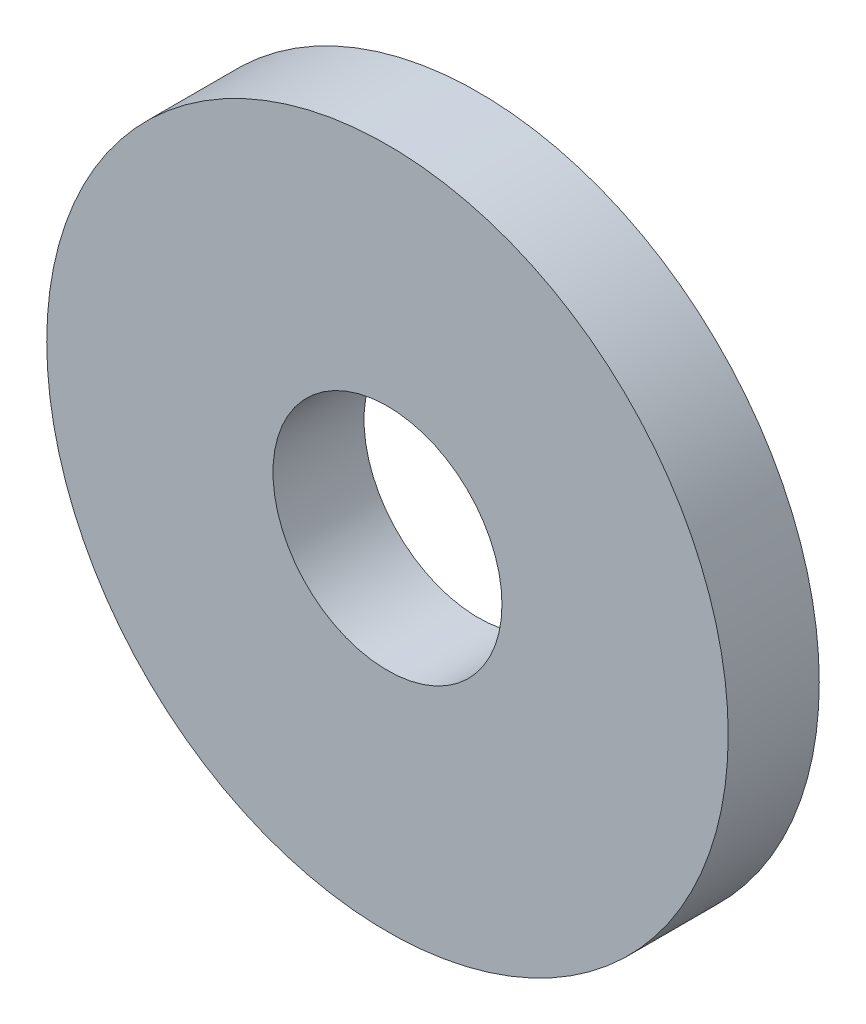
ISO-10303-21;
HEADER;
FILE_DESCRIPTION(('STEP AP214'),'2;1');
FILE_NAME('part.step','',(''),(''),'','','');
FILE_SCHEMA(('AUTOMOTIVE_DESIGN { 1 0 10303 214 1 1 1 1 }'));
ENDSEC;
DATA;
#1=APPLICATION_CONTEXT('core data for automotive mechanical design processes');
#2=APPLICATION_PROTOCOL_DEFINITION('international standard','automotive_design',2000,#1);
#3=PRODUCT_CONTEXT('',#1,'mechanical');
#4=PRODUCT('Part','Part','',(#3));
#5=PRODUCT_RELATED_PRODUCT_CATEGORY('part','',(#4));
#6=PRODUCT_DEFINITION_FORMATION('','',#4);
#7=PRODUCT_DEFINITION_CONTEXT('part definition',#1,'design');
#8=PRODUCT_DEFINITION('design','',#6,#7);
#9=PRODUCT_DEFINITION_SHAPE('','',#8);
#10=(LENGTH_UNIT() NAMED_UNIT(*) SI_UNIT(.MILLI.,.METRE.));
#11=(NAMED_UNIT(*) PLANE_ANGLE_UNIT() SI_UNIT($,.RADIAN.));
#12=(NAMED_UNIT(*) SI_UNIT($,.STERADIAN.) SOLID_ANGLE_UNIT());
#13=UNCERTAINTY_MEASURE_WITH_UNIT(LENGTH_MEASURE(1.E-05),#10,'distance_accuracy_value','');
#14=(GEOMETRIC_REPRESENTATION_CONTEXT(3) GLOBAL_UNCERTAINTY_ASSIGNED_CONTEXT((#13)) GLOBAL_UNIT_ASSIGNED_CONTEXT((#10,
#11,#12)) REPRESENTATION_CONTEXT('',''));
#15=CARTESIAN_POINT('',(0.,0.,0.));
#16=DIRECTION('',(0.,0.,1.));
#17=DIRECTION('',(1.,0.,0.));
#18=AXIS2_PLACEMENT_3D('',#15,#16,#17);
#19=CARTESIAN_POINT('',(0.,0.,4.));
#20=DIRECTION('',(0.,0.,1.));
#21=DIRECTION('',(1.,0.,0.));
#22=AXIS2_PLACEMENT_3D('',#19,#20,#21);
#23=PLANE('',#22);
#24=CARTESIAN_POINT('',(0.,0.,4.));
#25=DIRECTION('',(0.,0.,1.));
#26=DIRECTION('',(1.,0.,0.));
#27=AXIS2_PLACEMENT_3D('',#24,#25,#26);
#28=CIRCLE('',#27,14.97);
#29=CARTESIAN_POINT('',(14.97,0.,4.));
#30=VERTEX_POINT('',#29);
#31=EDGE_CURVE('E10',#30,#30,#28,.T.);
#32=ORIENTED_EDGE('',*,*,#31,.T.);
#33=EDGE_LOOP('',(#32));
#34=FACE_BOUND('',#33,.T.);
#35=CARTESIAN_POINT('',(0.,0.,4.));
#36=DIRECTION('',(0.,0.,1.));
#37=DIRECTION('',(1.,0.,0.));
#38=AXIS2_PLACEMENT_3D('',#35,#36,#37);
#39=CIRCLE('',#38,5.03);
#40=CARTESIAN_POINT('',(5.03,0.,4.));
#41=VERTEX_POINT('',#40);
#42=EDGE_CURVE('E50',#41,#41,#39,.T.);
#43=ORIENTED_EDGE('',*,*,#42,.F.);
#44=EDGE_LOOP('',(#43));
#45=FACE_BOUND('',#44,.T.);
#46=ADVANCED_FACE('F37',(#34,#45),#23,.T.);
#47=CARTESIAN_POINT('',(0.,0.,0.));
#48=DIRECTION('',(0.,0.,1.));
#49=DIRECTION('',(1.,0.,0.));
#50=AXIS2_PLACEMENT_3D('',#47,#48,#49);
#51=PLANE('',#50);
#52=CARTESIAN_POINT('',(0.,0.,0.));
#53=DIRECTION('',(0.,0.,1.));
#54=DIRECTION('',(1.,0.,0.));
#55=AXIS2_PLACEMENT_3D('',#52,#53,#54);
#56=CIRCLE('',#55,14.97);
#57=CARTESIAN_POINT('',(14.97,0.,0.));
#58=VERTEX_POINT('',#57);
#59=EDGE_CURVE('E41',#58,#58,#56,.T.);
#60=ORIENTED_EDGE('',*,*,#59,.F.);
#61=EDGE_LOOP('',(#60));
#62=FACE_BOUND('',#61,.T.);
#63=CARTESIAN_POINT('',(0.,0.,0.));
#64=DIRECTION('',(0.,0.,1.));
#65=DIRECTION('',(1.,0.,0.));
#66=AXIS2_PLACEMENT_3D('',#63,#64,#65);
#67=CIRCLE('',#66,5.03);
#68=CARTESIAN_POINT('',(5.03,0.,0.));
#69=VERTEX_POINT('',#68);
#70=EDGE_CURVE('E52',#69,#69,#67,.T.);
#71=ORIENTED_EDGE('',*,*,#70,.T.);
#72=EDGE_LOOP('',(#71));
#73=FACE_BOUND('',#72,.T.);
#74=ADVANCED_FACE('F64',(#62,#73),#51,.F.);
#75=CARTESIAN_POINT('',(0.,0.,4.));
#76=DIRECTION('',(0.,0.,-1.));
#77=DIRECTION('',(-1.,0.,0.));
#78=AXIS2_PLACEMENT_3D('',#75,#76,#77);
#79=CYLINDRICAL_SURFACE('',#78,14.97);
#80=ORIENTED_EDGE('',*,*,#31,.F.);
#81=EDGE_LOOP('',(#80));
#82=FACE_BOUND('',#81,.T.);
#83=ORIENTED_EDGE('',*,*,#59,.T.);
#84=EDGE_LOOP('',(#83));
#85=FACE_BOUND('',#84,.T.);
#86=ADVANCED_FACE('F39',(#82,#85),#79,.T.);
#87=CARTESIAN_POINT('',(0.,0.,4.));
#88=DIRECTION('',(0.,0.,-1.));
#89=DIRECTION('',(-1.,0.,0.));
#90=AXIS2_PLACEMENT_3D('',#87,#88,#89);
#91=CYLINDRICAL_SURFACE('',#90,5.03);
#92=ORIENTED_EDGE('',*,*,#42,.T.);
#93=EDGE_LOOP('',(#92));
#94=FACE_BOUND('',#93,.T.);
#95=ORIENTED_EDGE('',*,*,#70,.F.);
#96=EDGE_LOOP('',(#95));
#97=FACE_BOUND('',#96,.T.);
#98=ADVANCED_FACE('F60',(#94,#97),#91,.F.);
#99=CLOSED_SHELL('',(#46,#74,#86,#98));
#100=MANIFOLD_SOLID_BREP('B2',#99);
#101=ADVANCED_BREP_SHAPE_REPRESENTATION('',(#18,#100),#14);
#102=SHAPE_DEFINITION_REPRESENTATION(#9,#101);
ENDSEC;
END-ISO-10303-21;
